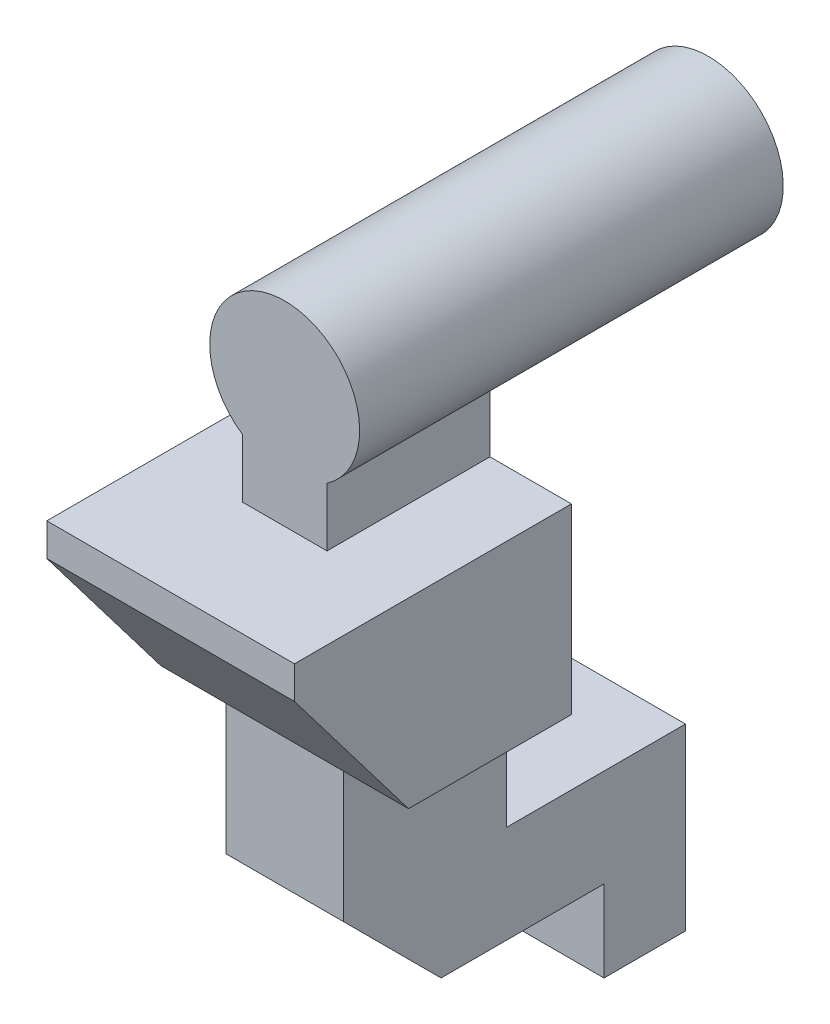
ISO-10303-21;
HEADER;
FILE_DESCRIPTION(('STEP AP214'),'2;1');
FILE_NAME('part.step','',(''),(''),'','','');
FILE_SCHEMA(('AUTOMOTIVE_DESIGN { 1 0 10303 214 1 1 1 1 }'));
ENDSEC;
DATA;
#1=APPLICATION_CONTEXT('core data for automotive mechanical design processes');
#2=APPLICATION_PROTOCOL_DEFINITION('international standard','automotive_design',2000,#1);
#3=PRODUCT_CONTEXT('',#1,'mechanical');
#4=PRODUCT('Part','Part','',(#3));
#5=PRODUCT_RELATED_PRODUCT_CATEGORY('part','',(#4));
#6=PRODUCT_DEFINITION_FORMATION('','',#4);
#7=PRODUCT_DEFINITION_CONTEXT('part definition',#1,'design');
#8=PRODUCT_DEFINITION('design','',#6,#7);
#9=PRODUCT_DEFINITION_SHAPE('','',#8);
#10=(LENGTH_UNIT() NAMED_UNIT(*) SI_UNIT(.MILLI.,.METRE.));
#11=(NAMED_UNIT(*) PLANE_ANGLE_UNIT() SI_UNIT($,.RADIAN.));
#12=(NAMED_UNIT(*) SI_UNIT($,.STERADIAN.) SOLID_ANGLE_UNIT());
#13=UNCERTAINTY_MEASURE_WITH_UNIT(LENGTH_MEASURE(1.E-05),#10,'distance_accuracy_value','');
#14=(GEOMETRIC_REPRESENTATION_CONTEXT(3) GLOBAL_UNCERTAINTY_ASSIGNED_CONTEXT((#13)) GLOBAL_UNIT_ASSIGNED_CONTEXT((#10,
#11,#12)) REPRESENTATION_CONTEXT('',''));
#15=CARTESIAN_POINT('',(0.,0.,0.));
#16=DIRECTION('',(0.,0.,1.));
#17=DIRECTION('',(1.,0.,0.));
#18=AXIS2_PLACEMENT_3D('',#15,#16,#17);
#19=CARTESIAN_POINT('',(0.,0.,5.));
#20=DIRECTION('',(0.,0.,1.));
#21=DIRECTION('',(1.,0.,0.));
#22=AXIS2_PLACEMENT_3D('',#19,#20,#21);
#23=PLANE('',#22);
#24=DIRECTION('',(0.,1.,0.));
#25=VECTOR('',#24,1.);
#26=CARTESIAN_POINT('',(-1.3,0.,5.));
#27=LINE('',#26,#25);
#28=CARTESIAN_POINT('',(-1.3,2.8,5.));
#29=VERTEX_POINT('',#28);
#30=CARTESIAN_POINT('',(-1.3,4.6,5.));
#31=VERTEX_POINT('',#30);
#32=EDGE_CURVE('E239',#29,#31,#27,.T.);
#33=ORIENTED_EDGE('',*,*,#32,.F.);
#34=DIRECTION('',(1.,0.,0.));
#35=VECTOR('',#34,1.);
#36=CARTESIAN_POINT('',(-3.8,2.8,5.));
#37=LINE('',#36,#35);
#38=CARTESIAN_POINT('',(1.3,2.8,5.));
#39=VERTEX_POINT('',#38);
#40=EDGE_CURVE('E77',#29,#39,#37,.T.);
#41=ORIENTED_EDGE('',*,*,#40,.T.);
#42=DIRECTION('',(0.,1.,0.));
#43=VECTOR('',#42,1.);
#44=CARTESIAN_POINT('',(1.3,0.,5.));
#45=LINE('',#44,#43);
#46=CARTESIAN_POINT('',(1.3,4.6,5.));
#47=VERTEX_POINT('',#46);
#48=EDGE_CURVE('E256',#39,#47,#45,.T.);
#49=ORIENTED_EDGE('',*,*,#48,.T.);
#50=CARTESIAN_POINT('',(0.,6.49736659610103,5.));
#51=DIRECTION('',(0.,0.,1.));
#52=DIRECTION('',(1.,0.,0.));
#53=AXIS2_PLACEMENT_3D('',#50,#51,#52);
#54=CIRCLE('',#53,2.3);
#55=EDGE_CURVE('E243',#47,#31,#54,.T.);
#56=ORIENTED_EDGE('',*,*,#55,.T.);
#57=EDGE_LOOP('',(#33,#41,#49,#56));
#58=FACE_BOUND('',#57,.T.);
#59=ADVANCED_FACE('F67',(#58),#23,.T.);
#60=CARTESIAN_POINT('',(0.,0.,0.));
#61=DIRECTION('',(0.,0.,1.));
#62=DIRECTION('',(1.,0.,0.));
#63=AXIS2_PLACEMENT_3D('',#60,#61,#62);
#64=PLANE('',#63);
#65=DIRECTION('',(0.,1.,0.));
#66=VECTOR('',#65,1.);
#67=CARTESIAN_POINT('',(1.8,-9.8,0.));
#68=LINE('',#67,#66);
#69=CARTESIAN_POINT('',(1.8,-6.8,0.));
#70=VERTEX_POINT('',#69);
#71=CARTESIAN_POINT('',(1.8,-2.8,0.));
#72=VERTEX_POINT('',#71);
#73=EDGE_CURVE('E211',#70,#72,#68,.T.);
#74=ORIENTED_EDGE('',*,*,#73,.F.);
#75=DIRECTION('',(-1.,0.,0.));
#76=VECTOR('',#75,1.);
#77=CARTESIAN_POINT('',(1.8,-6.8,0.));
#78=LINE('',#77,#76);
#79=CARTESIAN_POINT('',(-1.8,-6.8,0.));
#80=VERTEX_POINT('',#79);
#81=EDGE_CURVE('E195',#70,#80,#78,.T.);
#82=ORIENTED_EDGE('',*,*,#81,.T.);
#83=DIRECTION('',(0.,-1.,0.));
#84=VECTOR('',#83,1.);
#85=CARTESIAN_POINT('',(-1.8,-2.8,0.));
#86=LINE('',#85,#84);
#87=CARTESIAN_POINT('',(-1.8,-2.8,0.));
#88=VERTEX_POINT('',#87);
#89=EDGE_CURVE('E223',#88,#80,#86,.T.);
#90=ORIENTED_EDGE('',*,*,#89,.F.);
#91=DIRECTION('',(1.,0.,0.));
#92=VECTOR('',#91,1.);
#93=CARTESIAN_POINT('',(-3.8,-2.8,0.));
#94=LINE('',#93,#92);
#95=CARTESIAN_POINT('',(-3.8,-2.8,0.));
#96=VERTEX_POINT('',#95);
#97=EDGE_CURVE('E279',#96,#88,#94,.T.);
#98=ORIENTED_EDGE('',*,*,#97,.F.);
#99=DIRECTION('',(0.,-1.,0.));
#100=VECTOR('',#99,1.);
#101=CARTESIAN_POINT('',(-3.8,2.8,0.));
#102=LINE('',#101,#100);
#103=CARTESIAN_POINT('',(-3.8,2.8,0.));
#104=VERTEX_POINT('',#103);
#105=EDGE_CURVE('E277',#104,#96,#102,.T.);
#106=ORIENTED_EDGE('',*,*,#105,.F.);
#107=DIRECTION('',(-1.,0.,0.));
#108=VECTOR('',#107,1.);
#109=CARTESIAN_POINT('',(-3.8,2.8,0.));
#110=LINE('',#109,#108);
#111=CARTESIAN_POINT('',(-1.3,2.8,0.));
#112=VERTEX_POINT('',#111);
#113=EDGE_CURVE('E273',#112,#104,#110,.T.);
#114=ORIENTED_EDGE('',*,*,#113,.F.);
#115=DIRECTION('',(0.,1.,0.));
#116=VECTOR('',#115,1.);
#117=CARTESIAN_POINT('',(-1.3,0.,0.));
#118=LINE('',#117,#116);
#119=CARTESIAN_POINT('',(-1.3,4.6,0.));
#120=VERTEX_POINT('',#119);
#121=EDGE_CURVE('E252',#112,#120,#118,.T.);
#122=ORIENTED_EDGE('',*,*,#121,.T.);
#123=CARTESIAN_POINT('',(0.,6.49736659610103,0.));
#124=DIRECTION('',(0.,0.,-1.));
#125=DIRECTION('',(-1.,0.,0.));
#126=AXIS2_PLACEMENT_3D('',#123,#124,#125);
#127=CIRCLE('',#126,2.3);
#128=CARTESIAN_POINT('',(1.3,4.6,0.));
#129=VERTEX_POINT('',#128);
#130=EDGE_CURVE('E309',#129,#120,#127,.T.);
#131=ORIENTED_EDGE('',*,*,#130,.F.);
#132=DIRECTION('',(0.,1.,0.));
#133=VECTOR('',#132,1.);
#134=CARTESIAN_POINT('',(1.3,0.,0.));
#135=LINE('',#134,#133);
#136=CARTESIAN_POINT('',(1.3,2.8,0.));
#137=VERTEX_POINT('',#136);
#138=EDGE_CURVE('E255',#137,#129,#135,.T.);
#139=ORIENTED_EDGE('',*,*,#138,.F.);
#140=CARTESIAN_POINT('',(3.8,2.8,0.));
#141=VERTEX_POINT('',#140);
#142=EDGE_CURVE('E274',#141,#137,#110,.T.);
#143=ORIENTED_EDGE('',*,*,#142,.F.);
#144=DIRECTION('',(0.,1.,0.));
#145=VECTOR('',#144,1.);
#146=CARTESIAN_POINT('',(3.8,2.8,0.));
#147=LINE('',#146,#145);
#148=CARTESIAN_POINT('',(3.8,-2.8,0.));
#149=VERTEX_POINT('',#148);
#150=EDGE_CURVE('E250',#149,#141,#147,.T.);
#151=ORIENTED_EDGE('',*,*,#150,.F.);
#152=EDGE_CURVE('E221',#72,#149,#94,.T.);
#153=ORIENTED_EDGE('',*,*,#152,.F.);
#154=EDGE_LOOP('',(#74,#82,#90,#98,#106,#114,#122,#131,#139,#143,#151,#153));
#155=FACE_BOUND('',#154,.T.);
#156=ADVANCED_FACE('F219',(#155),#64,.F.);
#157=CARTESIAN_POINT('',(-3.8,-2.8,5.));
#158=DIRECTION('',(0.,1.,0.));
#159=DIRECTION('',(0.,0.,1.));
#160=AXIS2_PLACEMENT_3D('',#157,#158,#159);
#161=PLANE('',#160);
#162=DIRECTION('',(0.,0.,1.));
#163=VECTOR('',#162,1.);
#164=CARTESIAN_POINT('',(1.8,-2.8,0.));
#165=LINE('',#164,#163);
#166=CARTESIAN_POINT('',(1.8,-2.8,5.));
#167=VERTEX_POINT('',#166);
#168=EDGE_CURVE('E237',#72,#167,#165,.T.);
#169=ORIENTED_EDGE('',*,*,#168,.F.);
#170=ORIENTED_EDGE('',*,*,#152,.T.);
#171=DIRECTION('',(0.,0.,-1.));
#172=VECTOR('',#171,1.);
#173=CARTESIAN_POINT('',(3.8,-2.8,5.));
#174=LINE('',#173,#172);
#175=CARTESIAN_POINT('',(3.8,-2.8,5.));
#176=VERTEX_POINT('',#175);
#177=EDGE_CURVE('E269',#176,#149,#174,.T.);
#178=ORIENTED_EDGE('',*,*,#177,.F.);
#179=DIRECTION('',(1.,0.,0.));
#180=VECTOR('',#179,1.);
#181=CARTESIAN_POINT('',(-3.8,-2.8,5.));
#182=LINE('',#181,#180);
#183=EDGE_CURVE('E270',#167,#176,#182,.T.);
#184=ORIENTED_EDGE('',*,*,#183,.F.);
#185=EDGE_LOOP('',(#169,#170,#178,#184));
#186=FACE_BOUND('',#185,.T.);
#187=ADVANCED_FACE('F386',(#186),#161,.F.);
#188=CARTESIAN_POINT('',(3.8,2.8,5.));
#189=DIRECTION('',(-1.,0.,0.));
#190=DIRECTION('',(0.,-1.,0.));
#191=AXIS2_PLACEMENT_3D('',#188,#189,#190);
#192=PLANE('',#191);
#193=ORIENTED_EDGE('',*,*,#150,.T.);
#194=DIRECTION('',(0.,0.,-1.));
#195=VECTOR('',#194,1.);
#196=CARTESIAN_POINT('',(3.8,2.8,5.));
#197=LINE('',#196,#195);
#198=CARTESIAN_POINT('',(3.8,2.8,8.5));
#199=VERTEX_POINT('',#198);
#200=EDGE_CURVE('E290',#199,#141,#197,.T.);
#201=ORIENTED_EDGE('',*,*,#200,.F.);
#202=DIRECTION('',(0.,-1.,0.));
#203=VECTOR('',#202,1.);
#204=CARTESIAN_POINT('',(3.8,2.8,8.5));
#205=LINE('',#204,#203);
#206=CARTESIAN_POINT('',(3.8,1.8,8.5));
#207=VERTEX_POINT('',#206);
#208=EDGE_CURVE('E325',#199,#207,#205,.T.);
#209=ORIENTED_EDGE('',*,*,#208,.T.);
#210=DIRECTION('',(0.,-0.795828694120859,-0.605521832483262));
#211=VECTOR('',#210,1.);
#212=CARTESIAN_POINT('',(3.8,1.8,8.5));
#213=LINE('',#212,#211);
#214=EDGE_CURVE('E321',#207,#176,#213,.T.);
#215=ORIENTED_EDGE('',*,*,#214,.T.);
#216=ORIENTED_EDGE('',*,*,#177,.T.);
#217=EDGE_LOOP('',(#193,#201,#209,#215,#216));
#218=FACE_BOUND('',#217,.T.);
#219=ADVANCED_FACE('F381',(#218),#192,.F.);
#220=CARTESIAN_POINT('',(-3.8,2.8,5.));
#221=DIRECTION('',(0.,-1.,0.));
#222=DIRECTION('',(0.,0.,-1.));
#223=AXIS2_PLACEMENT_3D('',#220,#221,#222);
#224=PLANE('',#223);
#225=ORIENTED_EDGE('',*,*,#142,.T.);
#226=DIRECTION('',(0.,0.,1.));
#227=VECTOR('',#226,1.);
#228=CARTESIAN_POINT('',(1.3,2.8,0.));
#229=LINE('',#228,#227);
#230=EDGE_CURVE('E247',#137,#39,#229,.T.);
#231=ORIENTED_EDGE('',*,*,#230,.T.);
#232=ORIENTED_EDGE('',*,*,#40,.F.);
#233=DIRECTION('',(0.,0.,1.));
#234=VECTOR('',#233,1.);
#235=CARTESIAN_POINT('',(-1.3,2.8,0.));
#236=LINE('',#235,#234);
#237=EDGE_CURVE('E259',#112,#29,#236,.T.);
#238=ORIENTED_EDGE('',*,*,#237,.F.);
#239=ORIENTED_EDGE('',*,*,#113,.T.);
#240=DIRECTION('',(0.,0.,-1.));
#241=VECTOR('',#240,1.);
#242=CARTESIAN_POINT('',(-3.8,2.8,5.));
#243=LINE('',#242,#241);
#244=CARTESIAN_POINT('',(-3.8,2.8,8.5));
#245=VERTEX_POINT('',#244);
#246=EDGE_CURVE('E287',#245,#104,#243,.T.);
#247=ORIENTED_EDGE('',*,*,#246,.F.);
#248=DIRECTION('',(1.,0.,0.));
#249=VECTOR('',#248,1.);
#250=CARTESIAN_POINT('',(-3.8,2.8,8.5));
#251=LINE('',#250,#249);
#252=EDGE_CURVE('E306',#245,#199,#251,.T.);
#253=ORIENTED_EDGE('',*,*,#252,.T.);
#254=ORIENTED_EDGE('',*,*,#200,.T.);
#255=EDGE_LOOP('',(#225,#231,#232,#238,#239,#247,#253,#254));
#256=FACE_BOUND('',#255,.T.);
#257=ADVANCED_FACE('F369',(#256),#224,.F.);
#258=CARTESIAN_POINT('',(-3.8,2.8,5.));
#259=DIRECTION('',(1.,0.,0.));
#260=DIRECTION('',(0.,1.,0.));
#261=AXIS2_PLACEMENT_3D('',#258,#259,#260);
#262=PLANE('',#261);
#263=ORIENTED_EDGE('',*,*,#105,.T.);
#264=DIRECTION('',(0.,0.,-1.));
#265=VECTOR('',#264,1.);
#266=CARTESIAN_POINT('',(-3.8,-2.8,5.));
#267=LINE('',#266,#265);
#268=CARTESIAN_POINT('',(-3.8,-2.8,5.));
#269=VERTEX_POINT('',#268);
#270=EDGE_CURVE('E284',#269,#96,#267,.T.);
#271=ORIENTED_EDGE('',*,*,#270,.F.);
#272=DIRECTION('',(0.,-0.795828694120859,-0.605521832483262));
#273=VECTOR('',#272,1.);
#274=CARTESIAN_POINT('',(-3.8,1.8,8.5));
#275=LINE('',#274,#273);
#276=CARTESIAN_POINT('',(-3.8,1.8,8.5));
#277=VERTEX_POINT('',#276);
#278=EDGE_CURVE('E319',#277,#269,#275,.T.);
#279=ORIENTED_EDGE('',*,*,#278,.F.);
#280=DIRECTION('',(0.,-1.,0.));
#281=VECTOR('',#280,1.);
#282=CARTESIAN_POINT('',(-3.8,2.8,8.5));
#283=LINE('',#282,#281);
#284=EDGE_CURVE('E324',#245,#277,#283,.T.);
#285=ORIENTED_EDGE('',*,*,#284,.F.);
#286=ORIENTED_EDGE('',*,*,#246,.T.);
#287=EDGE_LOOP('',(#263,#271,#279,#285,#286));
#288=FACE_BOUND('',#287,.T.);
#289=ADVANCED_FACE('F364',(#288),#262,.F.);
#290=ORIENTED_EDGE('',*,*,#97,.T.);
#291=DIRECTION('',(0.,0.,1.));
#292=VECTOR('',#291,1.);
#293=CARTESIAN_POINT('',(-1.8,-2.8,0.));
#294=LINE('',#293,#292);
#295=CARTESIAN_POINT('',(-1.8,-2.8,5.));
#296=VERTEX_POINT('',#295);
#297=EDGE_CURVE('E222',#88,#296,#294,.T.);
#298=ORIENTED_EDGE('',*,*,#297,.T.);
#299=EDGE_CURVE('E266',#269,#296,#182,.T.);
#300=ORIENTED_EDGE('',*,*,#299,.F.);
#301=ORIENTED_EDGE('',*,*,#270,.T.);
#302=EDGE_LOOP('',(#290,#298,#300,#301));
#303=FACE_BOUND('',#302,.T.);
#304=ADVANCED_FACE('F360',(#303),#161,.F.);
#305=DIRECTION('',(1.,0.,0.));
#306=VECTOR('',#305,1.);
#307=CARTESIAN_POINT('',(-3.8,-2.8,5.));
#308=LINE('',#307,#306);
#309=EDGE_CURVE('E12',#296,#167,#308,.T.);
#310=ORIENTED_EDGE('',*,*,#309,.F.);
#311=DIRECTION('',(0.,-1.,0.));
#312=VECTOR('',#311,1.);
#313=CARTESIAN_POINT('',(-1.8,-2.8,5.));
#314=LINE('',#313,#312);
#315=CARTESIAN_POINT('',(-1.8,-6.8,5.));
#316=VERTEX_POINT('',#315);
#317=EDGE_CURVE('E232',#296,#316,#314,.T.);
#318=ORIENTED_EDGE('',*,*,#317,.T.);
#319=DIRECTION('',(1.,0.,0.));
#320=VECTOR('',#319,1.);
#321=CARTESIAN_POINT('',(0.,-6.8,5.));
#322=LINE('',#321,#320);
#323=CARTESIAN_POINT('',(1.8,-6.8,5.));
#324=VERTEX_POINT('',#323);
#325=EDGE_CURVE('E293',#316,#324,#322,.T.);
#326=ORIENTED_EDGE('',*,*,#325,.T.);
#327=DIRECTION('',(0.,1.,0.));
#328=VECTOR('',#327,1.);
#329=CARTESIAN_POINT('',(1.8,-9.8,5.));
#330=LINE('',#329,#328);
#331=EDGE_CURVE('E228',#324,#167,#330,.T.);
#332=ORIENTED_EDGE('',*,*,#331,.T.);
#333=EDGE_LOOP('',(#310,#318,#326,#332));
#334=FACE_BOUND('',#333,.T.);
#335=ADVANCED_FACE('F390',(#334),#23,.T.);
#336=CARTESIAN_POINT('',(0.,6.49736659610103,0.));
#337=DIRECTION('',(0.,0.,1.));
#338=DIRECTION('',(1.,0.,0.));
#339=AXIS2_PLACEMENT_3D('',#336,#337,#338);
#340=CYLINDRICAL_SURFACE('',#339,2.3);
#341=ORIENTED_EDGE('',*,*,#55,.F.);
#342=DIRECTION('',(0.,0.,1.));
#343=VECTOR('',#342,1.);
#344=CARTESIAN_POINT('',(1.3,4.6,0.));
#345=LINE('',#344,#343);
#346=EDGE_CURVE('E246',#129,#47,#345,.T.);
#347=ORIENTED_EDGE('',*,*,#346,.F.);
#348=ORIENTED_EDGE('',*,*,#130,.T.);
#349=DIRECTION('',(0.,0.,1.));
#350=VECTOR('',#349,1.);
#351=CARTESIAN_POINT('',(-1.3,4.6,0.));
#352=LINE('',#351,#350);
#353=EDGE_CURVE('E248',#120,#31,#352,.T.);
#354=ORIENTED_EDGE('',*,*,#353,.T.);
#355=EDGE_LOOP('',(#341,#347,#348,#354));
#356=FACE_BOUND('',#355,.T.);
#357=CARTESIAN_POINT('',(0.,6.49736659610103,-8.));
#358=DIRECTION('',(0.,0.,-1.));
#359=DIRECTION('',(-1.,0.,0.));
#360=AXIS2_PLACEMENT_3D('',#357,#358,#359);
#361=CIRCLE('',#360,2.3);
#362=CARTESIAN_POINT('',(-2.3,6.49736659610103,-8.));
#363=VERTEX_POINT('',#362);
#364=EDGE_CURVE('E235',#363,#363,#361,.T.);
#365=ORIENTED_EDGE('',*,*,#364,.F.);
#366=EDGE_LOOP('',(#365));
#367=FACE_BOUND('',#366,.T.);
#368=ADVANCED_FACE('F375',(#356,#367),#340,.T.);
#369=CARTESIAN_POINT('',(-1.3,0.,0.));
#370=DIRECTION('',(1.,0.,0.));
#371=DIRECTION('',(0.,0.,-1.));
#372=AXIS2_PLACEMENT_3D('',#369,#370,#371);
#373=PLANE('',#372);
#374=ORIENTED_EDGE('',*,*,#32,.T.);
#375=ORIENTED_EDGE('',*,*,#353,.F.);
#376=ORIENTED_EDGE('',*,*,#121,.F.);
#377=ORIENTED_EDGE('',*,*,#237,.T.);
#378=EDGE_LOOP('',(#374,#375,#376,#377));
#379=FACE_BOUND('',#378,.T.);
#380=ADVANCED_FACE('F372',(#379),#373,.F.);
#381=CARTESIAN_POINT('',(1.3,0.,0.));
#382=DIRECTION('',(1.,0.,0.));
#383=DIRECTION('',(0.,0.,-1.));
#384=AXIS2_PLACEMENT_3D('',#381,#382,#383);
#385=PLANE('',#384);
#386=ORIENTED_EDGE('',*,*,#48,.F.);
#387=ORIENTED_EDGE('',*,*,#230,.F.);
#388=ORIENTED_EDGE('',*,*,#138,.T.);
#389=ORIENTED_EDGE('',*,*,#346,.T.);
#390=EDGE_LOOP('',(#386,#387,#388,#389));
#391=FACE_BOUND('',#390,.T.);
#392=ADVANCED_FACE('F379',(#391),#385,.T.);
#393=CARTESIAN_POINT('',(1.8,-9.8,0.));
#394=DIRECTION('',(1.,0.,0.));
#395=DIRECTION('',(0.,0.,-1.));
#396=AXIS2_PLACEMENT_3D('',#393,#394,#395);
#397=PLANE('',#396);
#398=ORIENTED_EDGE('',*,*,#331,.F.);
#399=DIRECTION('',(0.,0.707106781186546,0.707106781186549));
#400=VECTOR('',#399,1.);
#401=CARTESIAN_POINT('',(1.8,-10.8,0.999999999999992));
#402=LINE('',#401,#400);
#403=CARTESIAN_POINT('',(1.8,-9.8,1.99999999999999));
#404=VERTEX_POINT('',#403);
#405=EDGE_CURVE('E93',#324,#404,#402,.F.);
#406=ORIENTED_EDGE('',*,*,#405,.T.);
#407=DIRECTION('',(0.,0.,1.));
#408=VECTOR('',#407,1.);
#409=CARTESIAN_POINT('',(1.8,-9.8,0.));
#410=LINE('',#409,#408);
#411=CARTESIAN_POINT('',(1.8,-9.8,-3.));
#412=VERTEX_POINT('',#411);
#413=EDGE_CURVE('E240',#412,#404,#410,.T.);
#414=ORIENTED_EDGE('',*,*,#413,.F.);
#415=DIRECTION('',(0.,1.,0.));
#416=VECTOR('',#415,1.);
#417=CARTESIAN_POINT('',(1.8,-9.8,-3.));
#418=LINE('',#417,#416);
#419=CARTESIAN_POINT('',(1.8,-12.3,-3.));
#420=VERTEX_POINT('',#419);
#421=EDGE_CURVE('E206',#420,#412,#418,.T.);
#422=ORIENTED_EDGE('',*,*,#421,.F.);
#423=DIRECTION('',(0.,0.,1.));
#424=VECTOR('',#423,1.);
#425=CARTESIAN_POINT('',(1.8,-12.3,-3.));
#426=LINE('',#425,#424);
#427=CARTESIAN_POINT('',(1.8,-12.3,-5.5));
#428=VERTEX_POINT('',#427);
#429=EDGE_CURVE('E349',#428,#420,#426,.T.);
#430=ORIENTED_EDGE('',*,*,#429,.F.);
#431=DIRECTION('',(0.,-1.,0.));
#432=VECTOR('',#431,1.);
#433=CARTESIAN_POINT('',(1.8,-12.3,-5.5));
#434=LINE('',#433,#432);
#435=CARTESIAN_POINT('',(1.8,-6.8,-5.5));
#436=VERTEX_POINT('',#435);
#437=EDGE_CURVE('E215',#436,#428,#434,.T.);
#438=ORIENTED_EDGE('',*,*,#437,.F.);
#439=DIRECTION('',(0.,0.,-1.));
#440=VECTOR('',#439,1.);
#441=CARTESIAN_POINT('',(1.8,-6.8,-5.5));
#442=LINE('',#441,#440);
#443=EDGE_CURVE('E198',#70,#436,#442,.T.);
#444=ORIENTED_EDGE('',*,*,#443,.F.);
#445=ORIENTED_EDGE('',*,*,#73,.T.);
#446=ORIENTED_EDGE('',*,*,#168,.T.);
#447=EDGE_LOOP('',(#398,#406,#414,#422,#430,#438,#444,#445,#446));
#448=FACE_BOUND('',#447,.T.);
#449=ADVANCED_FACE('F209',(#448),#397,.T.);
#450=CARTESIAN_POINT('',(-1.8,-9.8,0.));
#451=DIRECTION('',(0.,-1.,0.));
#452=DIRECTION('',(0.,0.,-1.));
#453=AXIS2_PLACEMENT_3D('',#450,#451,#452);
#454=PLANE('',#453);
#455=ORIENTED_EDGE('',*,*,#413,.T.);
#456=DIRECTION('',(-1.,0.,0.));
#457=VECTOR('',#456,1.);
#458=CARTESIAN_POINT('',(-1.8,-9.8,1.99999999999999));
#459=LINE('',#458,#457);
#460=CARTESIAN_POINT('',(-1.8,-9.8,1.99999999999999));
#461=VERTEX_POINT('',#460);
#462=EDGE_CURVE('E85',#404,#461,#459,.T.);
#463=ORIENTED_EDGE('',*,*,#462,.T.);
#464=DIRECTION('',(0.,0.,1.));
#465=VECTOR('',#464,1.);
#466=CARTESIAN_POINT('',(-1.8,-9.8,0.));
#467=LINE('',#466,#465);
#468=CARTESIAN_POINT('',(-1.8,-9.8,-3.));
#469=VERTEX_POINT('',#468);
#470=EDGE_CURVE('E226',#469,#461,#467,.T.);
#471=ORIENTED_EDGE('',*,*,#470,.F.);
#472=DIRECTION('',(-1.,0.,0.));
#473=VECTOR('',#472,1.);
#474=CARTESIAN_POINT('',(1.8,-9.8,-3.));
#475=LINE('',#474,#473);
#476=EDGE_CURVE('E327',#412,#469,#475,.T.);
#477=ORIENTED_EDGE('',*,*,#476,.F.);
#478=EDGE_LOOP('',(#455,#463,#471,#477));
#479=FACE_BOUND('',#478,.T.);
#480=ADVANCED_FACE('F465',(#479),#454,.T.);
#481=CARTESIAN_POINT('',(-1.8,-2.8,0.));
#482=DIRECTION('',(-1.,0.,0.));
#483=DIRECTION('',(0.,-1.,0.));
#484=AXIS2_PLACEMENT_3D('',#481,#482,#483);
#485=PLANE('',#484);
#486=ORIENTED_EDGE('',*,*,#470,.T.);
#487=DIRECTION('',(0.,-0.707106781186546,-0.707106781186549));
#488=VECTOR('',#487,1.);
#489=CARTESIAN_POINT('',(-1.8,-7.30000000000001,4.49999999999999));
#490=LINE('',#489,#488);
#491=EDGE_CURVE('E72',#461,#316,#490,.F.);
#492=ORIENTED_EDGE('',*,*,#491,.T.);
#493=ORIENTED_EDGE('',*,*,#317,.F.);
#494=ORIENTED_EDGE('',*,*,#297,.F.);
#495=ORIENTED_EDGE('',*,*,#89,.T.);
#496=DIRECTION('',(0.,0.,-1.));
#497=VECTOR('',#496,1.);
#498=CARTESIAN_POINT('',(-1.8,-6.8,-5.5));
#499=LINE('',#498,#497);
#500=CARTESIAN_POINT('',(-1.8,-6.8,-5.5));
#501=VERTEX_POINT('',#500);
#502=EDGE_CURVE('E200',#80,#501,#499,.T.);
#503=ORIENTED_EDGE('',*,*,#502,.T.);
#504=DIRECTION('',(0.,-1.,0.));
#505=VECTOR('',#504,1.);
#506=CARTESIAN_POINT('',(-1.8,-12.3,-5.5));
#507=LINE('',#506,#505);
#508=CARTESIAN_POINT('',(-1.8,-12.3,-5.5));
#509=VERTEX_POINT('',#508);
#510=EDGE_CURVE('E343',#501,#509,#507,.T.);
#511=ORIENTED_EDGE('',*,*,#510,.T.);
#512=DIRECTION('',(0.,0.,1.));
#513=VECTOR('',#512,1.);
#514=CARTESIAN_POINT('',(-1.8,-12.3,-3.));
#515=LINE('',#514,#513);
#516=CARTESIAN_POINT('',(-1.8,-12.3,-3.));
#517=VERTEX_POINT('',#516);
#518=EDGE_CURVE('E340',#509,#517,#515,.T.);
#519=ORIENTED_EDGE('',*,*,#518,.T.);
#520=DIRECTION('',(0.,1.,0.));
#521=VECTOR('',#520,1.);
#522=CARTESIAN_POINT('',(-1.8,-9.8,-3.));
#523=LINE('',#522,#521);
#524=EDGE_CURVE('E216',#517,#469,#523,.T.);
#525=ORIENTED_EDGE('',*,*,#524,.T.);
#526=EDGE_LOOP('',(#486,#492,#493,#494,#495,#503,#511,#519,#525));
#527=FACE_BOUND('',#526,.T.);
#528=ADVANCED_FACE('F356',(#527),#485,.T.);
#529=CARTESIAN_POINT('',(0.,6.49736659610103,-8.));
#530=DIRECTION('',(0.,0.,-1.));
#531=DIRECTION('',(-1.,0.,0.));
#532=AXIS2_PLACEMENT_3D('',#529,#530,#531);
#533=PLANE('',#532);
#534=ORIENTED_EDGE('',*,*,#364,.T.);
#535=EDGE_LOOP('',(#534));
#536=FACE_BOUND('',#535,.T.);
#537=ADVANCED_FACE('F394',(#536),#533,.T.);
#538=CARTESIAN_POINT('',(0.,-6.8,5.));
#539=DIRECTION('',(0.,0.707106781186549,-0.707106781186546));
#540=DIRECTION('',(1.,0.,0.));
#541=AXIS2_PLACEMENT_3D('',#538,#539,#540);
#542=PLANE('',#541);
#543=ORIENTED_EDGE('',*,*,#491,.F.);
#544=ORIENTED_EDGE('',*,*,#462,.F.);
#545=ORIENTED_EDGE('',*,*,#405,.F.);
#546=ORIENTED_EDGE('',*,*,#325,.F.);
#547=EDGE_LOOP('',(#543,#544,#545,#546));
#548=FACE_BOUND('',#547,.T.);
#549=ADVANCED_FACE('F70',(#548),#542,.F.);
#550=CARTESIAN_POINT('',(-3.8,1.8,8.5));
#551=DIRECTION('',(0.,-0.605521832483262,0.795828694120859));
#552=DIRECTION('',(0.,-0.795828694120859,-0.605521832483262));
#553=AXIS2_PLACEMENT_3D('',#550,#551,#552);
#554=PLANE('',#553);
#555=ORIENTED_EDGE('',*,*,#214,.F.);
#556=DIRECTION('',(1.,0.,0.));
#557=VECTOR('',#556,1.);
#558=CARTESIAN_POINT('',(-3.8,1.8,8.5));
#559=LINE('',#558,#557);
#560=EDGE_CURVE('E310',#277,#207,#559,.T.);
#561=ORIENTED_EDGE('',*,*,#560,.F.);
#562=ORIENTED_EDGE('',*,*,#278,.T.);
#563=ORIENTED_EDGE('',*,*,#299,.T.);
#564=ORIENTED_EDGE('',*,*,#309,.T.);
#565=ORIENTED_EDGE('',*,*,#183,.T.);
#566=EDGE_LOOP('',(#555,#561,#562,#563,#564,#565));
#567=FACE_BOUND('',#566,.T.);
#568=ADVANCED_FACE('F388',(#567),#554,.T.);
#569=CARTESIAN_POINT('',(-3.8,2.8,8.5));
#570=DIRECTION('',(0.,0.,1.));
#571=DIRECTION('',(1.,0.,0.));
#572=AXIS2_PLACEMENT_3D('',#569,#570,#571);
#573=PLANE('',#572);
#574=ORIENTED_EDGE('',*,*,#208,.F.);
#575=ORIENTED_EDGE('',*,*,#252,.F.);
#576=ORIENTED_EDGE('',*,*,#284,.T.);
#577=ORIENTED_EDGE('',*,*,#560,.T.);
#578=EDGE_LOOP('',(#574,#575,#576,#577));
#579=FACE_BOUND('',#578,.T.);
#580=ADVANCED_FACE('F400',(#579),#573,.T.);
#581=CARTESIAN_POINT('',(1.8,-9.8,-3.));
#582=DIRECTION('',(0.,0.,1.));
#583=DIRECTION('',(1.,0.,0.));
#584=AXIS2_PLACEMENT_3D('',#581,#582,#583);
#585=PLANE('',#584);
#586=ORIENTED_EDGE('',*,*,#524,.F.);
#587=DIRECTION('',(-1.,0.,0.));
#588=VECTOR('',#587,1.);
#589=CARTESIAN_POINT('',(1.8,-12.3,-3.));
#590=LINE('',#589,#588);
#591=EDGE_CURVE('E334',#420,#517,#590,.T.);
#592=ORIENTED_EDGE('',*,*,#591,.F.);
#593=ORIENTED_EDGE('',*,*,#421,.T.);
#594=ORIENTED_EDGE('',*,*,#476,.T.);
#595=EDGE_LOOP('',(#586,#592,#593,#594));
#596=FACE_BOUND('',#595,.T.);
#597=ADVANCED_FACE('F455',(#596),#585,.T.);
#598=CARTESIAN_POINT('',(1.8,-12.3,-3.));
#599=DIRECTION('',(0.,-1.,0.));
#600=DIRECTION('',(0.,0.,-1.));
#601=AXIS2_PLACEMENT_3D('',#598,#599,#600);
#602=PLANE('',#601);
#603=ORIENTED_EDGE('',*,*,#518,.F.);
#604=DIRECTION('',(-1.,0.,0.));
#605=VECTOR('',#604,1.);
#606=CARTESIAN_POINT('',(1.8,-12.3,-5.5));
#607=LINE('',#606,#605);
#608=EDGE_CURVE('E332',#428,#509,#607,.T.);
#609=ORIENTED_EDGE('',*,*,#608,.F.);
#610=ORIENTED_EDGE('',*,*,#429,.T.);
#611=ORIENTED_EDGE('',*,*,#591,.T.);
#612=EDGE_LOOP('',(#603,#609,#610,#611));
#613=FACE_BOUND('',#612,.T.);
#614=ADVANCED_FACE('F496',(#613),#602,.T.);
#615=CARTESIAN_POINT('',(1.8,-12.3,-5.5));
#616=DIRECTION('',(0.,0.,-1.));
#617=DIRECTION('',(0.,1.,0.));
#618=AXIS2_PLACEMENT_3D('',#615,#616,#617);
#619=PLANE('',#618);
#620=ORIENTED_EDGE('',*,*,#510,.F.);
#621=DIRECTION('',(-1.,0.,0.));
#622=VECTOR('',#621,1.);
#623=CARTESIAN_POINT('',(1.8,-6.8,-5.5));
#624=LINE('',#623,#622);
#625=EDGE_CURVE('E205',#436,#501,#624,.T.);
#626=ORIENTED_EDGE('',*,*,#625,.F.);
#627=ORIENTED_EDGE('',*,*,#437,.T.);
#628=ORIENTED_EDGE('',*,*,#608,.T.);
#629=EDGE_LOOP('',(#620,#626,#627,#628));
#630=FACE_BOUND('',#629,.T.);
#631=ADVANCED_FACE('F354',(#630),#619,.T.);
#632=CARTESIAN_POINT('',(1.8,-6.8,-5.5));
#633=DIRECTION('',(0.,1.,0.));
#634=DIRECTION('',(-1.,0.,0.));
#635=AXIS2_PLACEMENT_3D('',#632,#633,#634);
#636=PLANE('',#635);
#637=ORIENTED_EDGE('',*,*,#502,.F.);
#638=ORIENTED_EDGE('',*,*,#81,.F.);
#639=ORIENTED_EDGE('',*,*,#443,.T.);
#640=ORIENTED_EDGE('',*,*,#625,.T.);
#641=EDGE_LOOP('',(#637,#638,#639,#640));
#642=FACE_BOUND('',#641,.T.);
#643=ADVANCED_FACE('F197',(#642),#636,.T.);
#644=CLOSED_SHELL('',(#59,#156,#187,#219,#257,#289,#304,#335,#368,#380,#392,#449,#480,#528,#537,
#549,#568,#580,#597,#614,#631,#643));
#645=MANIFOLD_SOLID_BREP('B2',#644);
#646=ADVANCED_BREP_SHAPE_REPRESENTATION('',(#18,#645),#14);
#647=SHAPE_DEFINITION_REPRESENTATION(#9,#646);
ENDSEC;
END-ISO-10303-21;
